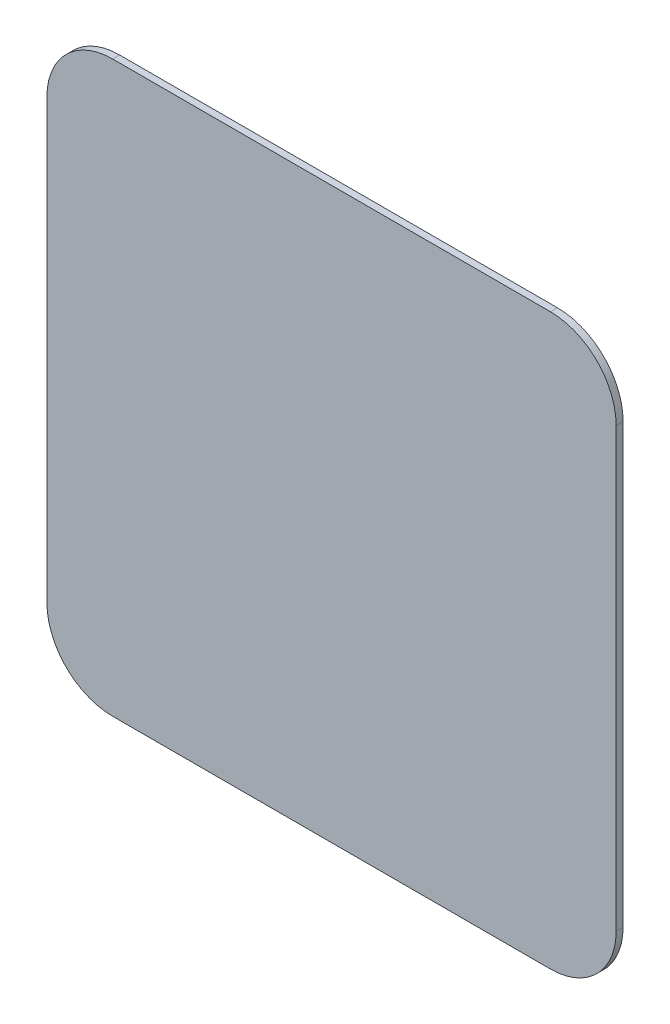
ISO-10303-21;
HEADER;
FILE_DESCRIPTION(('STEP AP214'),'2;1');
FILE_NAME('part.step','',(''),(''),'','','');
FILE_SCHEMA(('AUTOMOTIVE_DESIGN { 1 0 10303 214 1 1 1 1 }'));
ENDSEC;
DATA;
#1=APPLICATION_CONTEXT('core data for automotive mechanical design processes');
#2=APPLICATION_PROTOCOL_DEFINITION('international standard','automotive_design',2000,#1);
#3=PRODUCT_CONTEXT('',#1,'mechanical');
#4=PRODUCT('Part','Part','',(#3));
#5=PRODUCT_RELATED_PRODUCT_CATEGORY('part','',(#4));
#6=PRODUCT_DEFINITION_FORMATION('','',#4);
#7=PRODUCT_DEFINITION_CONTEXT('part definition',#1,'design');
#8=PRODUCT_DEFINITION('design','',#6,#7);
#9=PRODUCT_DEFINITION_SHAPE('','',#8);
#10=(LENGTH_UNIT() NAMED_UNIT(*) SI_UNIT(.MILLI.,.METRE.));
#11=(NAMED_UNIT(*) PLANE_ANGLE_UNIT() SI_UNIT($,.RADIAN.));
#12=(NAMED_UNIT(*) SI_UNIT($,.STERADIAN.) SOLID_ANGLE_UNIT());
#13=UNCERTAINTY_MEASURE_WITH_UNIT(LENGTH_MEASURE(1.E-05),#10,'distance_accuracy_value','');
#14=(GEOMETRIC_REPRESENTATION_CONTEXT(3) GLOBAL_UNCERTAINTY_ASSIGNED_CONTEXT((#13)) GLOBAL_UNIT_ASSIGNED_CONTEXT((#10,
#11,#12)) REPRESENTATION_CONTEXT('',''));
#15=CARTESIAN_POINT('',(0.,0.,0.));
#16=DIRECTION('',(0.,0.,1.));
#17=DIRECTION('',(1.,0.,0.));
#18=AXIS2_PLACEMENT_3D('',#15,#16,#17);
#19=CARTESIAN_POINT('',(79.716770430356,284.267870560164,-3.175));
#20=DIRECTION('',(0.,0.,1.));
#21=DIRECTION('',(1.,0.,0.));
#22=AXIS2_PLACEMENT_3D('',#19,#20,#21);
#23=CYLINDRICAL_SURFACE('',#22,30.);
#24=CARTESIAN_POINT('',(79.716770430356,284.267870560164,0.));
#25=DIRECTION('',(0.,0.,1.));
#26=DIRECTION('',(1.,0.,0.));
#27=AXIS2_PLACEMENT_3D('',#24,#25,#26);
#28=CIRCLE('',#27,30.);
#29=CARTESIAN_POINT('',(109.716770430356,284.267870560164,0.));
#30=VERTEX_POINT('',#29);
#31=CARTESIAN_POINT('',(79.716770430356,314.267870560164,0.));
#32=VERTEX_POINT('',#31);
#33=EDGE_CURVE('E129',#30,#32,#28,.T.);
#34=ORIENTED_EDGE('',*,*,#33,.F.);
#35=DIRECTION('',(0.,0.,1.));
#36=VECTOR('',#35,1.);
#37=CARTESIAN_POINT('',(109.716770430356,284.267870560164,-3.175));
#38=LINE('',#37,#36);
#39=CARTESIAN_POINT('',(109.716770430356,284.267870560164,-3.175));
#40=VERTEX_POINT('',#39);
#41=EDGE_CURVE('E11',#40,#30,#38,.T.);
#42=ORIENTED_EDGE('',*,*,#41,.F.);
#43=CARTESIAN_POINT('',(79.716770430356,284.267870560164,-3.175));
#44=DIRECTION('',(0.,0.,1.));
#45=DIRECTION('',(1.,0.,0.));
#46=AXIS2_PLACEMENT_3D('',#43,#44,#45);
#47=CIRCLE('',#46,30.);
#48=CARTESIAN_POINT('',(79.716770430356,314.267870560164,-3.175));
#49=VERTEX_POINT('',#48);
#50=EDGE_CURVE('E149',#40,#49,#47,.T.);
#51=ORIENTED_EDGE('',*,*,#50,.T.);
#52=DIRECTION('',(0.,0.,1.));
#53=VECTOR('',#52,1.);
#54=CARTESIAN_POINT('',(79.716770430356,314.267870560164,-3.175));
#55=LINE('',#54,#53);
#56=EDGE_CURVE('E35',#49,#32,#55,.T.);
#57=ORIENTED_EDGE('',*,*,#56,.T.);
#58=EDGE_LOOP('',(#34,#42,#51,#57));
#59=FACE_BOUND('',#58,.T.);
#60=ADVANCED_FACE('F32',(#59),#23,.T.);
#61=CARTESIAN_POINT('',(109.716770430356,84.2678705601637,-3.175));
#62=DIRECTION('',(1.,0.,0.));
#63=DIRECTION('',(0.,1.,0.));
#64=AXIS2_PLACEMENT_3D('',#61,#62,#63);
#65=PLANE('',#64);
#66=DIRECTION('',(0.,1.,0.));
#67=VECTOR('',#66,1.);
#68=CARTESIAN_POINT('',(109.716770430356,84.2678705601637,0.));
#69=LINE('',#68,#67);
#70=CARTESIAN_POINT('',(109.716770430356,84.2678705601637,0.));
#71=VERTEX_POINT('',#70);
#72=EDGE_CURVE('E147',#71,#30,#69,.T.);
#73=ORIENTED_EDGE('',*,*,#72,.F.);
#74=DIRECTION('',(0.,0.,1.));
#75=VECTOR('',#74,1.);
#76=CARTESIAN_POINT('',(109.716770430356,84.2678705601637,-3.175));
#77=LINE('',#76,#75);
#78=CARTESIAN_POINT('',(109.716770430356,84.2678705601637,-3.175));
#79=VERTEX_POINT('',#78);
#80=EDGE_CURVE('E41',#79,#71,#77,.T.);
#81=ORIENTED_EDGE('',*,*,#80,.F.);
#82=DIRECTION('',(0.,1.,0.));
#83=VECTOR('',#82,1.);
#84=CARTESIAN_POINT('',(109.716770430356,84.2678705601637,-3.175));
#85=LINE('',#84,#83);
#86=EDGE_CURVE('E119',#79,#40,#85,.T.);
#87=ORIENTED_EDGE('',*,*,#86,.T.);
#88=ORIENTED_EDGE('',*,*,#41,.T.);
#89=EDGE_LOOP('',(#73,#81,#87,#88));
#90=FACE_BOUND('',#89,.T.);
#91=ADVANCED_FACE('F161',(#90),#65,.T.);
#92=CARTESIAN_POINT('',(79.716770430356,84.2678705601637,-3.175));
#93=DIRECTION('',(0.,0.,1.));
#94=DIRECTION('',(1.,0.,0.));
#95=AXIS2_PLACEMENT_3D('',#92,#93,#94);
#96=CYLINDRICAL_SURFACE('',#95,30.);
#97=CARTESIAN_POINT('',(79.716770430356,84.2678705601637,0.));
#98=DIRECTION('',(0.,0.,1.));
#99=DIRECTION('',(1.,0.,0.));
#100=AXIS2_PLACEMENT_3D('',#97,#98,#99);
#101=CIRCLE('',#100,30.);
#102=CARTESIAN_POINT('',(79.716770430356,54.2678705601637,0.));
#103=VERTEX_POINT('',#102);
#104=EDGE_CURVE('E106',#103,#71,#101,.T.);
#105=ORIENTED_EDGE('',*,*,#104,.F.);
#106=DIRECTION('',(0.,0.,1.));
#107=VECTOR('',#106,1.);
#108=CARTESIAN_POINT('',(79.716770430356,54.2678705601637,-3.175));
#109=LINE('',#108,#107);
#110=CARTESIAN_POINT('',(79.716770430356,54.2678705601637,-3.175));
#111=VERTEX_POINT('',#110);
#112=EDGE_CURVE('E101',#111,#103,#109,.T.);
#113=ORIENTED_EDGE('',*,*,#112,.F.);
#114=CARTESIAN_POINT('',(79.716770430356,84.2678705601637,-3.175));
#115=DIRECTION('',(0.,0.,1.));
#116=DIRECTION('',(1.,0.,0.));
#117=AXIS2_PLACEMENT_3D('',#114,#115,#116);
#118=CIRCLE('',#117,30.);
#119=EDGE_CURVE('E104',#111,#79,#118,.T.);
#120=ORIENTED_EDGE('',*,*,#119,.T.);
#121=ORIENTED_EDGE('',*,*,#80,.T.);
#122=EDGE_LOOP('',(#105,#113,#120,#121));
#123=FACE_BOUND('',#122,.T.);
#124=ADVANCED_FACE('F103',(#123),#96,.T.);
#125=CARTESIAN_POINT('',(-120.283229569644,54.2678705601637,-3.175));
#126=DIRECTION('',(0.,-1.,0.));
#127=DIRECTION('',(0.,0.,-1.));
#128=AXIS2_PLACEMENT_3D('',#125,#126,#127);
#129=PLANE('',#128);
#130=DIRECTION('',(1.,0.,0.));
#131=VECTOR('',#130,1.);
#132=CARTESIAN_POINT('',(-120.283229569644,54.2678705601637,0.));
#133=LINE('',#132,#131);
#134=CARTESIAN_POINT('',(-120.283229569644,54.2678705601638,0.));
#135=VERTEX_POINT('',#134);
#136=EDGE_CURVE('E144',#135,#103,#133,.T.);
#137=ORIENTED_EDGE('',*,*,#136,.F.);
#138=DIRECTION('',(0.,0.,1.));
#139=VECTOR('',#138,1.);
#140=CARTESIAN_POINT('',(-120.283229569644,54.2678705601638,-3.175));
#141=LINE('',#140,#139);
#142=CARTESIAN_POINT('',(-120.283229569644,54.2678705601638,-3.175));
#143=VERTEX_POINT('',#142);
#144=EDGE_CURVE('E111',#143,#135,#141,.T.);
#145=ORIENTED_EDGE('',*,*,#144,.F.);
#146=DIRECTION('',(1.,0.,0.));
#147=VECTOR('',#146,1.);
#148=CARTESIAN_POINT('',(-120.283229569644,54.2678705601637,-3.175));
#149=LINE('',#148,#147);
#150=EDGE_CURVE('E117',#143,#111,#149,.T.);
#151=ORIENTED_EDGE('',*,*,#150,.T.);
#152=ORIENTED_EDGE('',*,*,#112,.T.);
#153=EDGE_LOOP('',(#137,#145,#151,#152));
#154=FACE_BOUND('',#153,.T.);
#155=ADVANCED_FACE('F121',(#154),#129,.T.);
#156=CARTESIAN_POINT('',(-120.283229569644,84.2678705601637,-3.175));
#157=DIRECTION('',(0.,0.,1.));
#158=DIRECTION('',(1.,0.,0.));
#159=AXIS2_PLACEMENT_3D('',#156,#157,#158);
#160=CYLINDRICAL_SURFACE('',#159,30.);
#161=CARTESIAN_POINT('',(-120.283229569644,84.2678705601637,0.));
#162=DIRECTION('',(0.,0.,1.));
#163=DIRECTION('',(1.,0.,0.));
#164=AXIS2_PLACEMENT_3D('',#161,#162,#163);
#165=CIRCLE('',#164,30.);
#166=CARTESIAN_POINT('',(-150.283229569644,84.2678705601637,0.));
#167=VERTEX_POINT('',#166);
#168=EDGE_CURVE('E141',#167,#135,#165,.T.);
#169=ORIENTED_EDGE('',*,*,#168,.F.);
#170=DIRECTION('',(0.,0.,1.));
#171=VECTOR('',#170,1.);
#172=CARTESIAN_POINT('',(-150.283229569644,84.2678705601637,-3.175));
#173=LINE('',#172,#171);
#174=CARTESIAN_POINT('',(-150.283229569644,84.2678705601637,-3.175));
#175=VERTEX_POINT('',#174);
#176=EDGE_CURVE('E153',#175,#167,#173,.T.);
#177=ORIENTED_EDGE('',*,*,#176,.F.);
#178=CARTESIAN_POINT('',(-120.283229569644,84.2678705601637,-3.175));
#179=DIRECTION('',(0.,0.,1.));
#180=DIRECTION('',(1.,0.,0.));
#181=AXIS2_PLACEMENT_3D('',#178,#179,#180);
#182=CIRCLE('',#181,30.);
#183=EDGE_CURVE('E122',#175,#143,#182,.T.);
#184=ORIENTED_EDGE('',*,*,#183,.T.);
#185=ORIENTED_EDGE('',*,*,#144,.T.);
#186=EDGE_LOOP('',(#169,#177,#184,#185));
#187=FACE_BOUND('',#186,.T.);
#188=ADVANCED_FACE('F174',(#187),#160,.T.);
#189=CARTESIAN_POINT('',(-150.283229569644,284.267870560164,-3.175));
#190=DIRECTION('',(-1.,0.,0.));
#191=DIRECTION('',(0.,-1.,0.));
#192=AXIS2_PLACEMENT_3D('',#189,#190,#191);
#193=PLANE('',#192);
#194=DIRECTION('',(0.,-1.,0.));
#195=VECTOR('',#194,1.);
#196=CARTESIAN_POINT('',(-150.283229569644,284.267870560164,0.));
#197=LINE('',#196,#195);
#198=CARTESIAN_POINT('',(-150.283229569644,284.267870560164,0.));
#199=VERTEX_POINT('',#198);
#200=EDGE_CURVE('E138',#199,#167,#197,.T.);
#201=ORIENTED_EDGE('',*,*,#200,.F.);
#202=DIRECTION('',(0.,0.,1.));
#203=VECTOR('',#202,1.);
#204=CARTESIAN_POINT('',(-150.283229569644,284.267870560164,-3.175));
#205=LINE('',#204,#203);
#206=CARTESIAN_POINT('',(-150.283229569644,284.267870560164,-3.175));
#207=VERTEX_POINT('',#206);
#208=EDGE_CURVE('E155',#207,#199,#205,.T.);
#209=ORIENTED_EDGE('',*,*,#208,.F.);
#210=DIRECTION('',(0.,-1.,0.));
#211=VECTOR('',#210,1.);
#212=CARTESIAN_POINT('',(-150.283229569644,284.267870560164,-3.175));
#213=LINE('',#212,#211);
#214=EDGE_CURVE('E124',#207,#175,#213,.T.);
#215=ORIENTED_EDGE('',*,*,#214,.T.);
#216=ORIENTED_EDGE('',*,*,#176,.T.);
#217=EDGE_LOOP('',(#201,#209,#215,#216));
#218=FACE_BOUND('',#217,.T.);
#219=ADVANCED_FACE('F177',(#218),#193,.T.);
#220=CARTESIAN_POINT('',(-120.283229569644,284.267870560164,-3.175));
#221=DIRECTION('',(0.,0.,1.));
#222=DIRECTION('',(1.,0.,0.));
#223=AXIS2_PLACEMENT_3D('',#220,#221,#222);
#224=CYLINDRICAL_SURFACE('',#223,30.);
#225=CARTESIAN_POINT('',(-120.283229569644,284.267870560164,0.));
#226=DIRECTION('',(0.,0.,1.));
#227=DIRECTION('',(1.,0.,0.));
#228=AXIS2_PLACEMENT_3D('',#225,#226,#227);
#229=CIRCLE('',#228,30.);
#230=CARTESIAN_POINT('',(-120.283229569644,314.267870560164,0.));
#231=VERTEX_POINT('',#230);
#232=EDGE_CURVE('E135',#231,#199,#229,.T.);
#233=ORIENTED_EDGE('',*,*,#232,.F.);
#234=DIRECTION('',(0.,0.,1.));
#235=VECTOR('',#234,1.);
#236=CARTESIAN_POINT('',(-120.283229569644,314.267870560164,-3.175));
#237=LINE('',#236,#235);
#238=CARTESIAN_POINT('',(-120.283229569644,314.267870560164,-3.175));
#239=VERTEX_POINT('',#238);
#240=EDGE_CURVE('E156',#239,#231,#237,.T.);
#241=ORIENTED_EDGE('',*,*,#240,.F.);
#242=CARTESIAN_POINT('',(-120.283229569644,284.267870560164,-3.175));
#243=DIRECTION('',(0.,0.,1.));
#244=DIRECTION('',(1.,0.,0.));
#245=AXIS2_PLACEMENT_3D('',#242,#243,#244);
#246=CIRCLE('',#245,30.);
#247=EDGE_CURVE('E252',#239,#207,#246,.T.);
#248=ORIENTED_EDGE('',*,*,#247,.T.);
#249=ORIENTED_EDGE('',*,*,#208,.T.);
#250=EDGE_LOOP('',(#233,#241,#248,#249));
#251=FACE_BOUND('',#250,.T.);
#252=ADVANCED_FACE('F181',(#251),#224,.T.);
#253=CARTESIAN_POINT('',(79.716770430356,314.267870560164,-3.175));
#254=DIRECTION('',(0.,1.,0.));
#255=DIRECTION('',(0.,0.,1.));
#256=AXIS2_PLACEMENT_3D('',#253,#254,#255);
#257=PLANE('',#256);
#258=DIRECTION('',(-1.,0.,0.));
#259=VECTOR('',#258,1.);
#260=CARTESIAN_POINT('',(79.716770430356,314.267870560164,0.));
#261=LINE('',#260,#259);
#262=EDGE_CURVE('E132',#32,#231,#261,.T.);
#263=ORIENTED_EDGE('',*,*,#262,.F.);
#264=ORIENTED_EDGE('',*,*,#56,.F.);
#265=DIRECTION('',(-1.,0.,0.));
#266=VECTOR('',#265,1.);
#267=CARTESIAN_POINT('',(79.716770430356,314.267870560164,-3.175));
#268=LINE('',#267,#266);
#269=EDGE_CURVE('E253',#49,#239,#268,.T.);
#270=ORIENTED_EDGE('',*,*,#269,.T.);
#271=ORIENTED_EDGE('',*,*,#240,.T.);
#272=EDGE_LOOP('',(#263,#264,#270,#271));
#273=FACE_BOUND('',#272,.T.);
#274=ADVANCED_FACE('F158',(#273),#257,.T.);
#275=CARTESIAN_POINT('',(79.716770430356,284.267870560164,-3.175));
#276=DIRECTION('',(0.,0.,1.));
#277=DIRECTION('',(1.,0.,0.));
#278=AXIS2_PLACEMENT_3D('',#275,#276,#277);
#279=PLANE('',#278);
#280=ORIENTED_EDGE('',*,*,#50,.F.);
#281=ORIENTED_EDGE('',*,*,#86,.F.);
#282=ORIENTED_EDGE('',*,*,#119,.F.);
#283=ORIENTED_EDGE('',*,*,#150,.F.);
#284=ORIENTED_EDGE('',*,*,#183,.F.);
#285=ORIENTED_EDGE('',*,*,#214,.F.);
#286=ORIENTED_EDGE('',*,*,#247,.F.);
#287=ORIENTED_EDGE('',*,*,#269,.F.);
#288=EDGE_LOOP('',(#280,#281,#282,#283,#284,#285,#286,#287));
#289=FACE_BOUND('',#288,.T.);
#290=ADVANCED_FACE('F115',(#289),#279,.F.);
#291=CARTESIAN_POINT('',(79.716770430356,284.267870560164,0.));
#292=DIRECTION('',(0.,0.,1.));
#293=DIRECTION('',(1.,0.,0.));
#294=AXIS2_PLACEMENT_3D('',#291,#292,#293);
#295=PLANE('',#294);
#296=ORIENTED_EDGE('',*,*,#33,.T.);
#297=ORIENTED_EDGE('',*,*,#262,.T.);
#298=ORIENTED_EDGE('',*,*,#232,.T.);
#299=ORIENTED_EDGE('',*,*,#200,.T.);
#300=ORIENTED_EDGE('',*,*,#168,.T.);
#301=ORIENTED_EDGE('',*,*,#136,.T.);
#302=ORIENTED_EDGE('',*,*,#104,.T.);
#303=ORIENTED_EDGE('',*,*,#72,.T.);
#304=EDGE_LOOP('',(#296,#297,#298,#299,#300,#301,#302,#303));
#305=FACE_BOUND('',#304,.T.);
#306=ADVANCED_FACE('F160',(#305),#295,.T.);
#307=CLOSED_SHELL('',(#60,#91,#124,#155,#188,#219,#252,#274,#290,#306));
#308=MANIFOLD_SOLID_BREP('B2',#307);
#309=ADVANCED_BREP_SHAPE_REPRESENTATION('',(#18,#308),#14);
#310=SHAPE_DEFINITION_REPRESENTATION(#9,#309);
ENDSEC;
END-ISO-10303-21;
